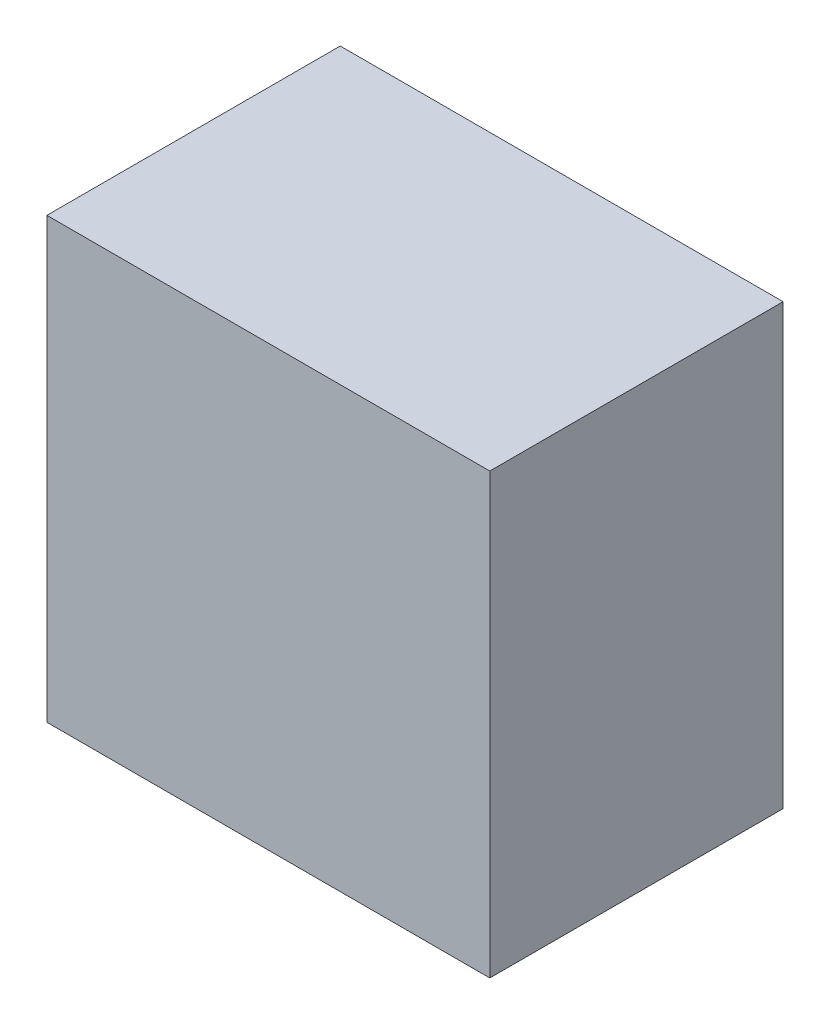
ISO-10303-21;
HEADER;
FILE_DESCRIPTION(('STEP AP214'),'2;1');
FILE_NAME('part.step','',(''),(''),'','','');
FILE_SCHEMA(('AUTOMOTIVE_DESIGN { 1 0 10303 214 1 1 1 1 }'));
ENDSEC;
DATA;
#1=APPLICATION_CONTEXT('core data for automotive mechanical design processes');
#2=APPLICATION_PROTOCOL_DEFINITION('international standard','automotive_design',2000,#1);
#3=PRODUCT_CONTEXT('',#1,'mechanical');
#4=PRODUCT('Part','Part','',(#3));
#5=PRODUCT_RELATED_PRODUCT_CATEGORY('part','',(#4));
#6=PRODUCT_DEFINITION_FORMATION('','',#4);
#7=PRODUCT_DEFINITION_CONTEXT('part definition',#1,'design');
#8=PRODUCT_DEFINITION('design','',#6,#7);
#9=PRODUCT_DEFINITION_SHAPE('','',#8);
#10=(LENGTH_UNIT() NAMED_UNIT(*) SI_UNIT(.MILLI.,.METRE.));
#11=(NAMED_UNIT(*) PLANE_ANGLE_UNIT() SI_UNIT($,.RADIAN.));
#12=(NAMED_UNIT(*) SI_UNIT($,.STERADIAN.) SOLID_ANGLE_UNIT());
#13=UNCERTAINTY_MEASURE_WITH_UNIT(LENGTH_MEASURE(1.E-05),#10,'distance_accuracy_value','');
#14=(GEOMETRIC_REPRESENTATION_CONTEXT(3) GLOBAL_UNCERTAINTY_ASSIGNED_CONTEXT((#13)) GLOBAL_UNIT_ASSIGNED_CONTEXT((#10,
#11,#12)) REPRESENTATION_CONTEXT('',''));
#15=CARTESIAN_POINT('',(0.,0.,0.));
#16=DIRECTION('',(0.,0.,1.));
#17=DIRECTION('',(1.,0.,0.));
#18=AXIS2_PLACEMENT_3D('',#15,#16,#17);
#19=CARTESIAN_POINT('',(-0.76,-0.697,1.));
#20=DIRECTION('',(1.,0.,0.));
#21=DIRECTION('',(0.,0.,-1.));
#22=AXIS2_PLACEMENT_3D('',#19,#20,#21);
#23=PLANE('',#22);
#24=DIRECTION('',(0.,-1.,0.));
#25=VECTOR('',#24,1.);
#26=CARTESIAN_POINT('',(-0.76,-0.697,0.));
#27=LINE('',#26,#25);
#28=CARTESIAN_POINT('',(-0.76,0.8,0.));
#29=VERTEX_POINT('',#28);
#30=CARTESIAN_POINT('',(-0.76,-0.697,0.));
#31=VERTEX_POINT('',#30);
#32=EDGE_CURVE('E95',#29,#31,#27,.T.);
#33=ORIENTED_EDGE('',*,*,#32,.T.);
#34=DIRECTION('',(0.,0.,-1.));
#35=VECTOR('',#34,1.);
#36=CARTESIAN_POINT('',(-0.76,-0.697,1.));
#37=LINE('',#36,#35);
#38=CARTESIAN_POINT('',(-0.76,-0.697,1.));
#39=VERTEX_POINT('',#38);
#40=EDGE_CURVE('E11',#39,#31,#37,.T.);
#41=ORIENTED_EDGE('',*,*,#40,.F.);
#42=DIRECTION('',(0.,-1.,0.));
#43=VECTOR('',#42,1.);
#44=CARTESIAN_POINT('',(-0.76,-0.697,1.));
#45=LINE('',#44,#43);
#46=CARTESIAN_POINT('',(-0.76,0.8,1.));
#47=VERTEX_POINT('',#46);
#48=EDGE_CURVE('E83',#47,#39,#45,.T.);
#49=ORIENTED_EDGE('',*,*,#48,.F.);
#50=DIRECTION('',(0.,0.,-1.));
#51=VECTOR('',#50,1.);
#52=CARTESIAN_POINT('',(-0.76,0.8,1.));
#53=LINE('',#52,#51);
#54=EDGE_CURVE('E91',#47,#29,#53,.T.);
#55=ORIENTED_EDGE('',*,*,#54,.T.);
#56=EDGE_LOOP('',(#33,#41,#49,#55));
#57=FACE_BOUND('',#56,.T.);
#58=ADVANCED_FACE('F32',(#57),#23,.F.);
#59=CARTESIAN_POINT('',(0.75,-0.697,1.));
#60=DIRECTION('',(0.,1.,0.));
#61=DIRECTION('',(0.,0.,1.));
#62=AXIS2_PLACEMENT_3D('',#59,#60,#61);
#63=PLANE('',#62);
#64=DIRECTION('',(1.,0.,0.));
#65=VECTOR('',#64,1.);
#66=CARTESIAN_POINT('',(0.75,-0.697,0.));
#67=LINE('',#66,#65);
#68=CARTESIAN_POINT('',(0.75,-0.697,0.));
#69=VERTEX_POINT('',#68);
#70=EDGE_CURVE('E87',#31,#69,#67,.T.);
#71=ORIENTED_EDGE('',*,*,#70,.T.);
#72=DIRECTION('',(0.,0.,-1.));
#73=VECTOR('',#72,1.);
#74=CARTESIAN_POINT('',(0.75,-0.697,1.));
#75=LINE('',#74,#73);
#76=CARTESIAN_POINT('',(0.75,-0.697,1.));
#77=VERTEX_POINT('',#76);
#78=EDGE_CURVE('E40',#77,#69,#75,.T.);
#79=ORIENTED_EDGE('',*,*,#78,.F.);
#80=DIRECTION('',(1.,0.,0.));
#81=VECTOR('',#80,1.);
#82=CARTESIAN_POINT('',(0.75,-0.697,1.));
#83=LINE('',#82,#81);
#84=EDGE_CURVE('E78',#39,#77,#83,.T.);
#85=ORIENTED_EDGE('',*,*,#84,.F.);
#86=ORIENTED_EDGE('',*,*,#40,.T.);
#87=EDGE_LOOP('',(#71,#79,#85,#86));
#88=FACE_BOUND('',#87,.T.);
#89=ADVANCED_FACE('F86',(#88),#63,.F.);
#90=CARTESIAN_POINT('',(0.75,0.8,1.));
#91=DIRECTION('',(-1.,0.,0.));
#92=DIRECTION('',(0.,0.,1.));
#93=AXIS2_PLACEMENT_3D('',#90,#91,#92);
#94=PLANE('',#93);
#95=DIRECTION('',(0.,1.,0.));
#96=VECTOR('',#95,1.);
#97=CARTESIAN_POINT('',(0.75,0.8,0.));
#98=LINE('',#97,#96);
#99=CARTESIAN_POINT('',(0.75,0.8,0.));
#100=VERTEX_POINT('',#99);
#101=EDGE_CURVE('E65',#69,#100,#98,.T.);
#102=ORIENTED_EDGE('',*,*,#101,.T.);
#103=DIRECTION('',(0.,0.,-1.));
#104=VECTOR('',#103,1.);
#105=CARTESIAN_POINT('',(0.75,0.8,1.));
#106=LINE('',#105,#104);
#107=CARTESIAN_POINT('',(0.75,0.8,1.));
#108=VERTEX_POINT('',#107);
#109=EDGE_CURVE('E88',#108,#100,#106,.T.);
#110=ORIENTED_EDGE('',*,*,#109,.F.);
#111=DIRECTION('',(0.,1.,0.));
#112=VECTOR('',#111,1.);
#113=CARTESIAN_POINT('',(0.75,0.8,1.));
#114=LINE('',#113,#112);
#115=EDGE_CURVE('E81',#77,#108,#114,.T.);
#116=ORIENTED_EDGE('',*,*,#115,.F.);
#117=ORIENTED_EDGE('',*,*,#78,.T.);
#118=EDGE_LOOP('',(#102,#110,#116,#117));
#119=FACE_BOUND('',#118,.T.);
#120=ADVANCED_FACE('F89',(#119),#94,.F.);
#121=CARTESIAN_POINT('',(-0.76,0.8,1.));
#122=DIRECTION('',(0.,-1.,0.));
#123=DIRECTION('',(0.,0.,-1.));
#124=AXIS2_PLACEMENT_3D('',#121,#122,#123);
#125=PLANE('',#124);
#126=DIRECTION('',(-1.,0.,0.));
#127=VECTOR('',#126,1.);
#128=CARTESIAN_POINT('',(-0.76,0.8,0.));
#129=LINE('',#128,#127);
#130=EDGE_CURVE('E71',#100,#29,#129,.T.);
#131=ORIENTED_EDGE('',*,*,#130,.T.);
#132=ORIENTED_EDGE('',*,*,#54,.F.);
#133=DIRECTION('',(-1.,0.,0.));
#134=VECTOR('',#133,1.);
#135=CARTESIAN_POINT('',(-0.76,0.8,1.));
#136=LINE('',#135,#134);
#137=EDGE_CURVE('E48',#108,#47,#136,.T.);
#138=ORIENTED_EDGE('',*,*,#137,.F.);
#139=ORIENTED_EDGE('',*,*,#109,.T.);
#140=EDGE_LOOP('',(#131,#132,#138,#139));
#141=FACE_BOUND('',#140,.T.);
#142=ADVANCED_FACE('F102',(#141),#125,.F.);
#143=CARTESIAN_POINT('',(0.,0.,1.));
#144=DIRECTION('',(0.,0.,-1.));
#145=DIRECTION('',(-1.,0.,0.));
#146=AXIS2_PLACEMENT_3D('',#143,#144,#145);
#147=PLANE('',#146);
#148=ORIENTED_EDGE('',*,*,#48,.T.);
#149=ORIENTED_EDGE('',*,*,#84,.T.);
#150=ORIENTED_EDGE('',*,*,#115,.T.);
#151=ORIENTED_EDGE('',*,*,#137,.T.);
#152=EDGE_LOOP('',(#148,#149,#150,#151));
#153=FACE_BOUND('',#152,.T.);
#154=ADVANCED_FACE('F79',(#153),#147,.F.);
#155=CARTESIAN_POINT('',(0.,0.,0.));
#156=DIRECTION('',(0.,0.,-1.));
#157=DIRECTION('',(-1.,0.,0.));
#158=AXIS2_PLACEMENT_3D('',#155,#156,#157);
#159=PLANE('',#158);
#160=ORIENTED_EDGE('',*,*,#32,.F.);
#161=ORIENTED_EDGE('',*,*,#130,.F.);
#162=ORIENTED_EDGE('',*,*,#101,.F.);
#163=ORIENTED_EDGE('',*,*,#70,.F.);
#164=EDGE_LOOP('',(#160,#161,#162,#163));
#165=FACE_BOUND('',#164,.T.);
#166=ADVANCED_FACE('F105',(#165),#159,.T.);
#167=CLOSED_SHELL('',(#58,#89,#120,#142,#154,#166));
#168=MANIFOLD_SOLID_BREP('B2',#167);
#169=ADVANCED_BREP_SHAPE_REPRESENTATION('',(#18,#168),#14);
#170=SHAPE_DEFINITION_REPRESENTATION(#9,#169);
ENDSEC;
END-ISO-10303-21;
